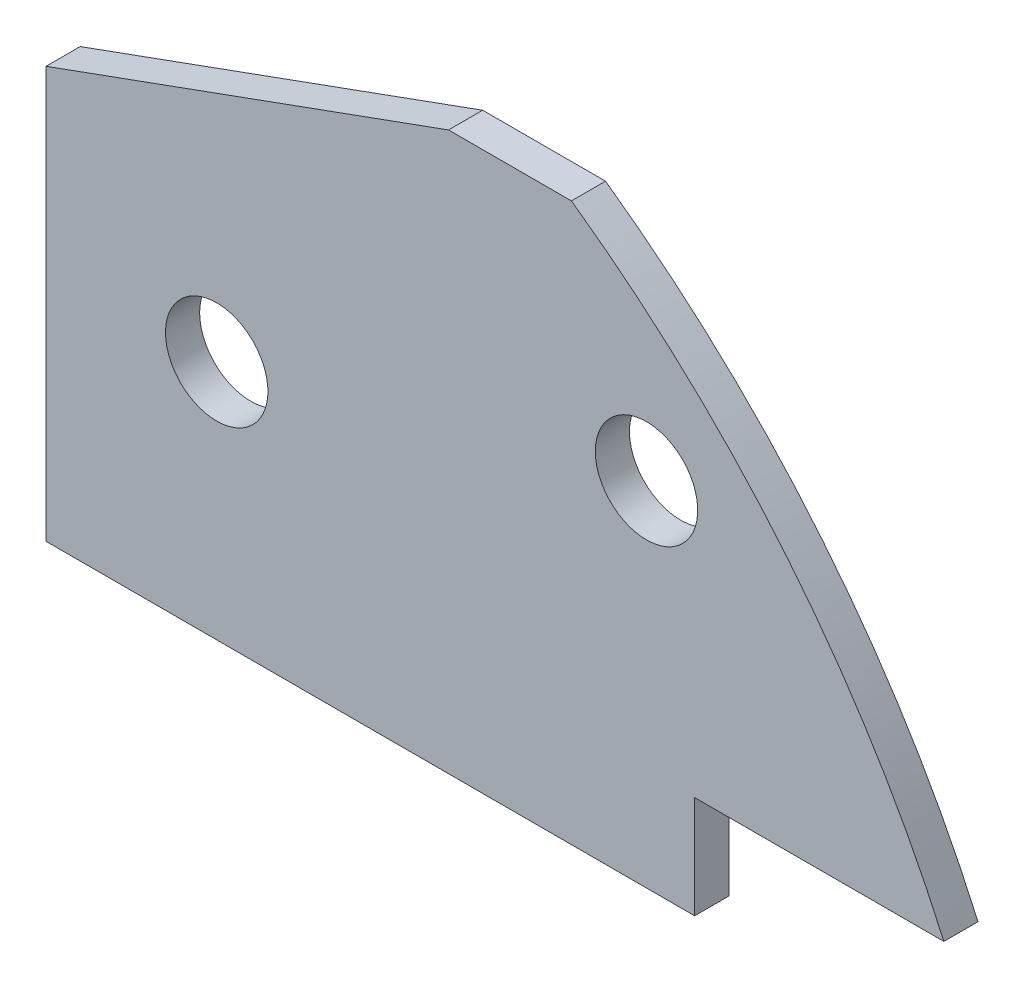
ISO-10303-21;
HEADER;
FILE_DESCRIPTION(('STEP AP214'),'2;1');
FILE_NAME('part.step','',(''),(''),'','','');
FILE_SCHEMA(('AUTOMOTIVE_DESIGN { 1 0 10303 214 1 1 1 1 }'));
ENDSEC;
DATA;
#1=APPLICATION_CONTEXT('core data for automotive mechanical design processes');
#2=APPLICATION_PROTOCOL_DEFINITION('international standard','automotive_design',2000,#1);
#3=PRODUCT_CONTEXT('',#1,'mechanical');
#4=PRODUCT('Part','Part','',(#3));
#5=PRODUCT_RELATED_PRODUCT_CATEGORY('part','',(#4));
#6=PRODUCT_DEFINITION_FORMATION('','',#4);
#7=PRODUCT_DEFINITION_CONTEXT('part definition',#1,'design');
#8=PRODUCT_DEFINITION('design','',#6,#7);
#9=PRODUCT_DEFINITION_SHAPE('','',#8);
#10=(LENGTH_UNIT() NAMED_UNIT(*) SI_UNIT(.MILLI.,.METRE.));
#11=(NAMED_UNIT(*) PLANE_ANGLE_UNIT() SI_UNIT($,.RADIAN.));
#12=(NAMED_UNIT(*) SI_UNIT($,.STERADIAN.) SOLID_ANGLE_UNIT());
#13=UNCERTAINTY_MEASURE_WITH_UNIT(LENGTH_MEASURE(1.E-05),#10,'distance_accuracy_value','');
#14=(GEOMETRIC_REPRESENTATION_CONTEXT(3) GLOBAL_UNCERTAINTY_ASSIGNED_CONTEXT((#13)) GLOBAL_UNIT_ASSIGNED_CONTEXT((#10,
#11,#12)) REPRESENTATION_CONTEXT('',''));
#15=CARTESIAN_POINT('',(0.,0.,0.));
#16=DIRECTION('',(0.,0.,1.));
#17=DIRECTION('',(1.,0.,0.));
#18=AXIS2_PLACEMENT_3D('',#15,#16,#17);
#19=CARTESIAN_POINT('',(0.,0.,0.));
#20=DIRECTION('',(0.,0.,1.));
#21=DIRECTION('',(1.,0.,0.));
#22=AXIS2_PLACEMENT_3D('',#19,#20,#21);
#23=PLANE('',#22);
#24=CARTESIAN_POINT('',(16.,20.5,0.));
#25=DIRECTION('',(0.,0.,-1.));
#26=DIRECTION('',(-1.,0.,0.));
#27=AXIS2_PLACEMENT_3D('',#24,#25,#26);
#28=CIRCLE('',#27,1.5);
#29=CARTESIAN_POINT('',(14.5,20.5,0.));
#30=VERTEX_POINT('',#29);
#31=EDGE_CURVE('E153',#30,#30,#28,.T.);
#32=ORIENTED_EDGE('',*,*,#31,.F.);
#33=EDGE_LOOP('',(#32));
#34=FACE_BOUND('',#33,.T.);
#35=CARTESIAN_POINT('',(28.5900387108147,23.7802641955972,0.));
#36=DIRECTION('',(0.,0.,1.));
#37=DIRECTION('',(-1.,0.,0.));
#38=AXIS2_PLACEMENT_3D('',#35,#36,#37);
#39=CIRCLE('',#38,1.5);
#40=CARTESIAN_POINT('',(27.0900387108147,23.7802641955972,0.));
#41=VERTEX_POINT('',#40);
#42=EDGE_CURVE('E146',#41,#41,#39,.T.);
#43=ORIENTED_EDGE('',*,*,#42,.T.);
#44=EDGE_LOOP('',(#43));
#45=FACE_BOUND('',#44,.T.);
#46=DIRECTION('',(-1.,0.,0.));
#47=VECTOR('',#46,1.);
#48=CARTESIAN_POINT('',(-30.,13.4492983568228,0.));
#49=LINE('',#48,#47);
#50=CARTESIAN_POINT('',(30.,13.4492983568228,0.));
#51=VERTEX_POINT('',#50);
#52=CARTESIAN_POINT('',(11.,13.4492983568228,0.));
#53=VERTEX_POINT('',#52);
#54=EDGE_CURVE('E106',#51,#53,#49,.T.);
#55=ORIENTED_EDGE('',*,*,#54,.T.);
#56=DIRECTION('',(0.,-1.,0.));
#57=VECTOR('',#56,1.);
#58=CARTESIAN_POINT('',(11.,13.4492983568228,0.));
#59=LINE('',#58,#57);
#60=CARTESIAN_POINT('',(11.,25.5,0.));
#61=VERTEX_POINT('',#60);
#62=EDGE_CURVE('E50',#61,#53,#59,.T.);
#63=ORIENTED_EDGE('',*,*,#62,.F.);
#64=DIRECTION('',(0.939973110395639,0.341248519019713,0.));
#65=VECTOR('',#64,1.);
#66=CARTESIAN_POINT('',(-6.89853694287744,19.0021021805552,0.));
#67=LINE('',#66,#65);
#68=CARTESIAN_POINT('',(22.7900387108147,29.7802641955972,0.));
#69=VERTEX_POINT('',#68);
#70=EDGE_CURVE('E99',#61,#69,#67,.T.);
#71=ORIENTED_EDGE('',*,*,#70,.T.);
#72=DIRECTION('',(-1.,0.,0.));
#73=VECTOR('',#72,1.);
#74=CARTESIAN_POINT('',(22.7900387108147,29.7802641955972,0.));
#75=LINE('',#74,#73);
#76=CARTESIAN_POINT('',(26.3900387108147,29.7802641955972,0.));
#77=VERTEX_POINT('',#76);
#78=EDGE_CURVE('E124',#77,#69,#75,.T.);
#79=ORIENTED_EDGE('',*,*,#78,.F.);
#80=CARTESIAN_POINT('',(7.61252759266184,3.28373542568486,0.));
#81=DIRECTION('',(0.,0.,1.));
#82=DIRECTION('',(1.,0.,0.));
#83=AXIS2_PLACEMENT_3D('',#80,#81,#82);
#84=CIRCLE('',#83,32.4755440392789);
#85=CARTESIAN_POINT('',(37.299711921146,16.4492983568228,0.));
#86=VERTEX_POINT('',#85);
#87=EDGE_CURVE('E128',#86,#77,#84,.T.);
#88=ORIENTED_EDGE('',*,*,#87,.F.);
#89=DIRECTION('',(1.,0.,0.));
#90=VECTOR('',#89,1.);
#91=CARTESIAN_POINT('',(0.,16.4492983568228,0.));
#92=LINE('',#91,#90);
#93=CARTESIAN_POINT('',(30.,16.4492983568228,0.));
#94=VERTEX_POINT('',#93);
#95=EDGE_CURVE('E110',#94,#86,#92,.T.);
#96=ORIENTED_EDGE('',*,*,#95,.F.);
#97=DIRECTION('',(0.,-1.,0.));
#98=VECTOR('',#97,1.);
#99=CARTESIAN_POINT('',(30.,16.4492983568228,0.));
#100=LINE('',#99,#98);
#101=EDGE_CURVE('E118',#94,#51,#100,.T.);
#102=ORIENTED_EDGE('',*,*,#101,.T.);
#103=EDGE_LOOP('',(#55,#63,#71,#79,#88,#96,#102));
#104=FACE_BOUND('',#103,.T.);
#105=ADVANCED_FACE('F34',(#34,#45,#104),#23,.F.);
#106=CARTESIAN_POINT('',(-6.89853694287744,19.0021021805552,3.));
#107=DIRECTION('',(-0.341248519019714,0.939973110395639,0.));
#108=DIRECTION('',(-0.939973110395639,-0.341248519019714,0.));
#109=AXIS2_PLACEMENT_3D('',#106,#107,#108);
#110=PLANE('',#109);
#111=DIRECTION('',(-0.939973110395639,-0.341248519019713,0.));
#112=VECTOR('',#111,1.);
#113=CARTESIAN_POINT('',(11.,25.5,1.));
#114=LINE('',#113,#112);
#115=CARTESIAN_POINT('',(22.7900387108147,29.7802641955972,1.));
#116=VERTEX_POINT('',#115);
#117=CARTESIAN_POINT('',(11.,25.5,0.999999999999999));
#118=VERTEX_POINT('',#117);
#119=EDGE_CURVE('E131',#116,#118,#114,.T.);
#120=ORIENTED_EDGE('',*,*,#119,.F.);
#121=DIRECTION('',(0.,0.,-1.));
#122=VECTOR('',#121,1.);
#123=CARTESIAN_POINT('',(22.7900387108147,29.7802641955972,3.));
#124=LINE('',#123,#122);
#125=EDGE_CURVE('E43',#116,#69,#124,.T.);
#126=ORIENTED_EDGE('',*,*,#125,.T.);
#127=ORIENTED_EDGE('',*,*,#70,.F.);
#128=DIRECTION('',(0.,0.,-1.));
#129=VECTOR('',#128,1.);
#130=CARTESIAN_POINT('',(11.,25.5,3.));
#131=LINE('',#130,#129);
#132=EDGE_CURVE('E91',#118,#61,#131,.T.);
#133=ORIENTED_EDGE('',*,*,#132,.F.);
#134=EDGE_LOOP('',(#120,#126,#127,#133));
#135=FACE_BOUND('',#134,.T.);
#136=ADVANCED_FACE('F36',(#135),#110,.T.);
#137=CARTESIAN_POINT('',(0.,16.4492983568228,0.));
#138=DIRECTION('',(0.,-1.,0.));
#139=DIRECTION('',(0.,0.,-1.));
#140=AXIS2_PLACEMENT_3D('',#137,#138,#139);
#141=PLANE('',#140);
#142=DIRECTION('',(1.,0.,0.));
#143=VECTOR('',#142,1.);
#144=CARTESIAN_POINT('',(30.,16.4492983568228,1.));
#145=LINE('',#144,#143);
#146=CARTESIAN_POINT('',(30.,16.4492983568228,1.));
#147=VERTEX_POINT('',#146);
#148=CARTESIAN_POINT('',(37.299711921146,16.4492983568228,1.));
#149=VERTEX_POINT('',#148);
#150=EDGE_CURVE('E57',#147,#149,#145,.T.);
#151=ORIENTED_EDGE('',*,*,#150,.F.);
#152=DIRECTION('',(0.,0.,1.));
#153=VECTOR('',#152,1.);
#154=CARTESIAN_POINT('',(30.,16.4492983568228,0.));
#155=LINE('',#154,#153);
#156=EDGE_CURVE('E112',#94,#147,#155,.T.);
#157=ORIENTED_EDGE('',*,*,#156,.F.);
#158=ORIENTED_EDGE('',*,*,#95,.T.);
#159=DIRECTION('',(0.,0.,1.));
#160=VECTOR('',#159,1.);
#161=CARTESIAN_POINT('',(37.299711921146,16.4492983568228,0.));
#162=LINE('',#161,#160);
#163=EDGE_CURVE('E121',#86,#149,#162,.T.);
#164=ORIENTED_EDGE('',*,*,#163,.T.);
#165=EDGE_LOOP('',(#151,#157,#158,#164));
#166=FACE_BOUND('',#165,.T.);
#167=ADVANCED_FACE('F176',(#166),#141,.T.);
#168=CARTESIAN_POINT('',(30.,16.4492983568228,0.));
#169=DIRECTION('',(-1.,0.,0.));
#170=DIRECTION('',(0.,-1.,0.));
#171=AXIS2_PLACEMENT_3D('',#168,#169,#170);
#172=PLANE('',#171);
#173=DIRECTION('',(0.,1.,0.));
#174=VECTOR('',#173,1.);
#175=CARTESIAN_POINT('',(30.,13.4492983568228,1.));
#176=LINE('',#175,#174);
#177=CARTESIAN_POINT('',(30.,13.4492983568228,1.));
#178=VERTEX_POINT('',#177);
#179=EDGE_CURVE('E138',#178,#147,#176,.T.);
#180=ORIENTED_EDGE('',*,*,#179,.F.);
#181=DIRECTION('',(0.,0.,1.));
#182=VECTOR('',#181,1.);
#183=CARTESIAN_POINT('',(30.,13.4492983568228,0.));
#184=LINE('',#183,#182);
#185=EDGE_CURVE('E142',#51,#178,#184,.T.);
#186=ORIENTED_EDGE('',*,*,#185,.F.);
#187=ORIENTED_EDGE('',*,*,#101,.F.);
#188=ORIENTED_EDGE('',*,*,#156,.T.);
#189=EDGE_LOOP('',(#180,#186,#187,#188));
#190=FACE_BOUND('',#189,.T.);
#191=ADVANCED_FACE('F181',(#190),#172,.F.);
#192=CARTESIAN_POINT('',(22.7900387108147,29.7802641955972,0.));
#193=DIRECTION('',(0.,1.,0.));
#194=DIRECTION('',(0.,0.,1.));
#195=AXIS2_PLACEMENT_3D('',#192,#193,#194);
#196=PLANE('',#195);
#197=DIRECTION('',(-1.,0.,0.));
#198=VECTOR('',#197,1.);
#199=CARTESIAN_POINT('',(22.7900387108147,29.7802641955972,1.));
#200=LINE('',#199,#198);
#201=CARTESIAN_POINT('',(26.3900387108147,29.7802641955972,1.));
#202=VERTEX_POINT('',#201);
#203=EDGE_CURVE('E133',#202,#116,#200,.T.);
#204=ORIENTED_EDGE('',*,*,#203,.F.);
#205=DIRECTION('',(0.,0.,1.));
#206=VECTOR('',#205,1.);
#207=CARTESIAN_POINT('',(26.3900387108147,29.7802641955972,0.));
#208=LINE('',#207,#206);
#209=EDGE_CURVE('E120',#77,#202,#208,.T.);
#210=ORIENTED_EDGE('',*,*,#209,.F.);
#211=ORIENTED_EDGE('',*,*,#78,.T.);
#212=ORIENTED_EDGE('',*,*,#125,.F.);
#213=EDGE_LOOP('',(#204,#210,#211,#212));
#214=FACE_BOUND('',#213,.T.);
#215=ADVANCED_FACE('F185',(#214),#196,.T.);
#216=CARTESIAN_POINT('',(7.61252759266184,3.28373542568486,0.));
#217=DIRECTION('',(0.,0.,1.));
#218=DIRECTION('',(1.,0.,0.));
#219=AXIS2_PLACEMENT_3D('',#216,#217,#218);
#220=CYLINDRICAL_SURFACE('',#219,32.4755440392789);
#221=CARTESIAN_POINT('',(7.61252759266107,3.28373542568421,1.));
#222=DIRECTION('',(0.,0.,1.));
#223=DIRECTION('',(1.,0.,0.));
#224=AXIS2_PLACEMENT_3D('',#221,#222,#223);
#225=CIRCLE('',#224,32.4755440392799);
#226=EDGE_CURVE('E135',#149,#202,#225,.T.);
#227=ORIENTED_EDGE('',*,*,#226,.F.);
#228=ORIENTED_EDGE('',*,*,#163,.F.);
#229=ORIENTED_EDGE('',*,*,#87,.T.);
#230=ORIENTED_EDGE('',*,*,#209,.T.);
#231=EDGE_LOOP('',(#227,#228,#229,#230));
#232=FACE_BOUND('',#231,.T.);
#233=ADVANCED_FACE('F187',(#232),#220,.T.);
#234=CARTESIAN_POINT('',(-7.61252759266062,3.28373542568388,1.));
#235=DIRECTION('',(0.,0.,-1.));
#236=DIRECTION('',(-1.,0.,0.));
#237=AXIS2_PLACEMENT_3D('',#234,#235,#236);
#238=PLANE('',#237);
#239=CARTESIAN_POINT('',(16.,20.5,0.999999999999999));
#240=DIRECTION('',(0.,0.,-1.));
#241=DIRECTION('',(-1.,0.,0.));
#242=AXIS2_PLACEMENT_3D('',#239,#240,#241);
#243=CIRCLE('',#242,1.5);
#244=CARTESIAN_POINT('',(14.5,20.5,0.999999999999999));
#245=VERTEX_POINT('',#244);
#246=EDGE_CURVE('E38',#245,#245,#243,.T.);
#247=ORIENTED_EDGE('',*,*,#246,.T.);
#248=EDGE_LOOP('',(#247));
#249=FACE_BOUND('',#248,.T.);
#250=CARTESIAN_POINT('',(28.5900387108147,23.7802641955972,1.));
#251=DIRECTION('',(0.,0.,1.));
#252=DIRECTION('',(-1.,0.,0.));
#253=AXIS2_PLACEMENT_3D('',#250,#251,#252);
#254=CIRCLE('',#253,1.5);
#255=CARTESIAN_POINT('',(27.0900387108147,23.7802641955972,1.));
#256=VERTEX_POINT('',#255);
#257=EDGE_CURVE('E147',#256,#256,#254,.T.);
#258=ORIENTED_EDGE('',*,*,#257,.F.);
#259=EDGE_LOOP('',(#258));
#260=FACE_BOUND('',#259,.T.);
#261=ORIENTED_EDGE('',*,*,#119,.T.);
#262=DIRECTION('',(0.,-1.,0.));
#263=VECTOR('',#262,1.);
#264=CARTESIAN_POINT('',(11.,3.28373542568389,1.));
#265=LINE('',#264,#263);
#266=CARTESIAN_POINT('',(11.,13.4492983568228,0.999999999999999));
#267=VERTEX_POINT('',#266);
#268=EDGE_CURVE('E94',#118,#267,#265,.T.);
#269=ORIENTED_EDGE('',*,*,#268,.T.);
#270=DIRECTION('',(1.,0.,0.));
#271=VECTOR('',#270,1.);
#272=CARTESIAN_POINT('',(-30.,13.4492983568228,1.));
#273=LINE('',#272,#271);
#274=EDGE_CURVE('E140',#267,#178,#273,.T.);
#275=ORIENTED_EDGE('',*,*,#274,.T.);
#276=ORIENTED_EDGE('',*,*,#179,.T.);
#277=ORIENTED_EDGE('',*,*,#150,.T.);
#278=ORIENTED_EDGE('',*,*,#226,.T.);
#279=ORIENTED_EDGE('',*,*,#203,.T.);
#280=EDGE_LOOP('',(#261,#269,#275,#276,#277,#278,#279));
#281=FACE_BOUND('',#280,.T.);
#282=ADVANCED_FACE('F160',(#249,#260,#281),#238,.F.);
#283=CARTESIAN_POINT('',(-30.,13.4492983568228,0.));
#284=DIRECTION('',(0.,1.,0.));
#285=DIRECTION('',(0.,0.,1.));
#286=AXIS2_PLACEMENT_3D('',#283,#284,#285);
#287=PLANE('',#286);
#288=ORIENTED_EDGE('',*,*,#274,.F.);
#289=DIRECTION('',(0.,0.,-1.));
#290=VECTOR('',#289,1.);
#291=CARTESIAN_POINT('',(11.,13.4492983568228,0.));
#292=LINE('',#291,#290);
#293=EDGE_CURVE('E11',#267,#53,#292,.T.);
#294=ORIENTED_EDGE('',*,*,#293,.T.);
#295=ORIENTED_EDGE('',*,*,#54,.F.);
#296=ORIENTED_EDGE('',*,*,#185,.T.);
#297=EDGE_LOOP('',(#288,#294,#295,#296));
#298=FACE_BOUND('',#297,.T.);
#299=ADVANCED_FACE('F196',(#298),#287,.F.);
#300=CARTESIAN_POINT('',(28.5900387108147,23.7802641955972,0.));
#301=DIRECTION('',(0.,0.,1.));
#302=DIRECTION('',(1.,0.,0.));
#303=AXIS2_PLACEMENT_3D('',#300,#301,#302);
#304=CYLINDRICAL_SURFACE('',#303,1.5);
#305=ORIENTED_EDGE('',*,*,#42,.F.);
#306=EDGE_LOOP('',(#305));
#307=FACE_BOUND('',#306,.T.);
#308=ORIENTED_EDGE('',*,*,#257,.T.);
#309=EDGE_LOOP('',(#308));
#310=FACE_BOUND('',#309,.T.);
#311=ADVANCED_FACE('F169',(#307,#310),#304,.F.);
#312=CARTESIAN_POINT('',(11.,13.4492983568228,10.));
#313=DIRECTION('',(1.,0.,0.));
#314=DIRECTION('',(0.,1.,0.));
#315=AXIS2_PLACEMENT_3D('',#312,#313,#314);
#316=PLANE('',#315);
#317=ORIENTED_EDGE('',*,*,#132,.T.);
#318=ORIENTED_EDGE('',*,*,#62,.T.);
#319=ORIENTED_EDGE('',*,*,#293,.F.);
#320=ORIENTED_EDGE('',*,*,#268,.F.);
#321=EDGE_LOOP('',(#317,#318,#319,#320));
#322=FACE_BOUND('',#321,.T.);
#323=ADVANCED_FACE('F92',(#322),#316,.F.);
#324=CARTESIAN_POINT('',(16.,20.5,10.));
#325=DIRECTION('',(0.,0.,-1.));
#326=DIRECTION('',(-1.,0.,0.));
#327=AXIS2_PLACEMENT_3D('',#324,#325,#326);
#328=CYLINDRICAL_SURFACE('',#327,1.5);
#329=ORIENTED_EDGE('',*,*,#31,.T.);
#330=EDGE_LOOP('',(#329));
#331=FACE_BOUND('',#330,.T.);
#332=ORIENTED_EDGE('',*,*,#246,.F.);
#333=EDGE_LOOP('',(#332));
#334=FACE_BOUND('',#333,.T.);
#335=ADVANCED_FACE('F163',(#331,#334),#328,.F.);
#336=CLOSED_SHELL('',(#105,#136,#167,#191,#215,#233,#282,#299,#311,#323,#335));
#337=MANIFOLD_SOLID_BREP('B2',#336);
#338=ADVANCED_BREP_SHAPE_REPRESENTATION('',(#18,#337),#14);
#339=SHAPE_DEFINITION_REPRESENTATION(#9,#338);
ENDSEC;
END-ISO-10303-21;
